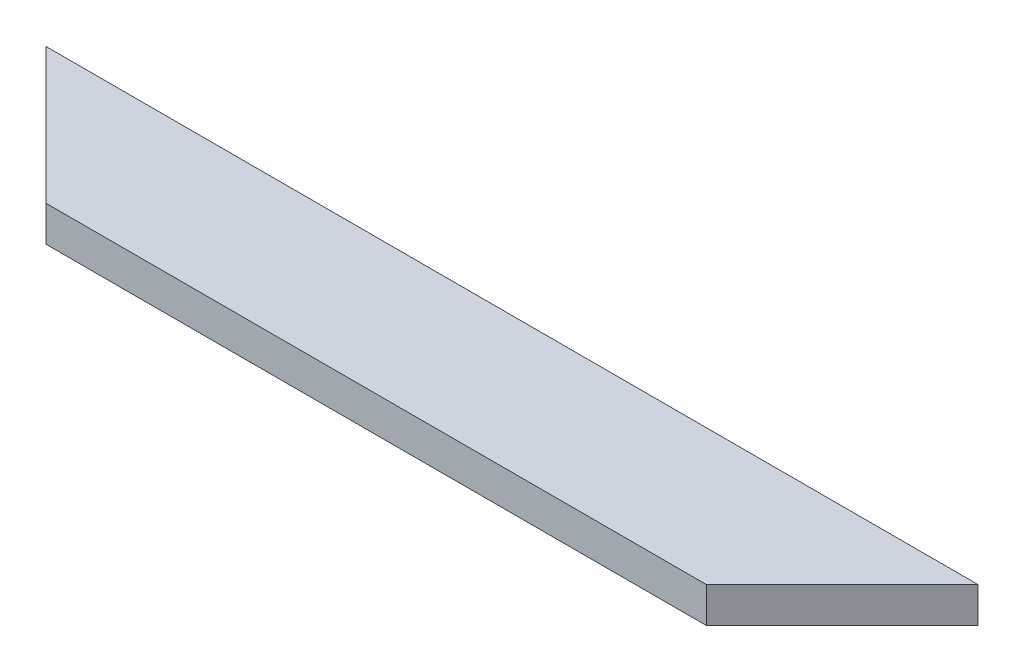
ISO-10303-21;
HEADER;
FILE_DESCRIPTION(('STEP AP214'),'2;1');
FILE_NAME('part.step','',(''),(''),'','','');
FILE_SCHEMA(('AUTOMOTIVE_DESIGN { 1 0 10303 214 1 1 1 1 }'));
ENDSEC;
DATA;
#1=APPLICATION_CONTEXT('core data for automotive mechanical design processes');
#2=APPLICATION_PROTOCOL_DEFINITION('international standard','automotive_design',2000,#1);
#3=PRODUCT_CONTEXT('',#1,'mechanical');
#4=PRODUCT('Part','Part','',(#3));
#5=PRODUCT_RELATED_PRODUCT_CATEGORY('part','',(#4));
#6=PRODUCT_DEFINITION_FORMATION('','',#4);
#7=PRODUCT_DEFINITION_CONTEXT('part definition',#1,'design');
#8=PRODUCT_DEFINITION('design','',#6,#7);
#9=PRODUCT_DEFINITION_SHAPE('','',#8);
#10=(LENGTH_UNIT() NAMED_UNIT(*) SI_UNIT(.MILLI.,.METRE.));
#11=(NAMED_UNIT(*) PLANE_ANGLE_UNIT() SI_UNIT($,.RADIAN.));
#12=(NAMED_UNIT(*) SI_UNIT($,.STERADIAN.) SOLID_ANGLE_UNIT());
#13=UNCERTAINTY_MEASURE_WITH_UNIT(LENGTH_MEASURE(1.E-05),#10,'distance_accuracy_value','');
#14=(GEOMETRIC_REPRESENTATION_CONTEXT(3) GLOBAL_UNCERTAINTY_ASSIGNED_CONTEXT((#13)) GLOBAL_UNIT_ASSIGNED_CONTEXT((#10,
#11,#12)) REPRESENTATION_CONTEXT('',''));
#15=CARTESIAN_POINT('',(0.,0.,0.));
#16=DIRECTION('',(0.,0.,1.));
#17=DIRECTION('',(1.,0.,0.));
#18=AXIS2_PLACEMENT_3D('',#15,#16,#17);
#19=CARTESIAN_POINT('',(0.,18.25625,0.));
#20=DIRECTION('',(0.,0.,1.));
#21=DIRECTION('',(1.,0.,0.));
#22=AXIS2_PLACEMENT_3D('',#19,#20,#21);
#23=PLANE('',#22);
#24=DIRECTION('',(-1.,0.,0.));
#25=VECTOR('',#24,1.);
#26=CARTESIAN_POINT('',(0.,0.,0.));
#27=LINE('',#26,#25);
#28=CARTESIAN_POINT('',(239.712500000001,0.,0.));
#29=VERTEX_POINT('',#28);
#30=CARTESIAN_POINT('',(-239.712500000001,0.,0.));
#31=VERTEX_POINT('',#30);
#32=EDGE_CURVE('E60',#29,#31,#27,.T.);
#33=ORIENTED_EDGE('',*,*,#32,.T.);
#34=DIRECTION('',(0.,-1.,0.));
#35=VECTOR('',#34,1.);
#36=CARTESIAN_POINT('',(-239.712500000001,18.25625,0.));
#37=LINE('',#36,#35);
#38=CARTESIAN_POINT('',(-239.712500000001,18.25625,0.));
#39=VERTEX_POINT('',#38);
#40=EDGE_CURVE('E11',#39,#31,#37,.T.);
#41=ORIENTED_EDGE('',*,*,#40,.F.);
#42=DIRECTION('',(-1.,0.,0.));
#43=VECTOR('',#42,1.);
#44=CARTESIAN_POINT('',(0.,18.25625,0.));
#45=LINE('',#44,#43);
#46=CARTESIAN_POINT('',(239.712500000001,18.25625,0.));
#47=VERTEX_POINT('',#46);
#48=EDGE_CURVE('E65',#47,#39,#45,.T.);
#49=ORIENTED_EDGE('',*,*,#48,.F.);
#50=DIRECTION('',(0.,-1.,0.));
#51=VECTOR('',#50,1.);
#52=CARTESIAN_POINT('',(239.712500000001,18.25625,0.));
#53=LINE('',#52,#51);
#54=EDGE_CURVE('E82',#47,#29,#53,.T.);
#55=ORIENTED_EDGE('',*,*,#54,.T.);
#56=EDGE_LOOP('',(#33,#41,#49,#55));
#57=FACE_BOUND('',#56,.T.);
#58=ADVANCED_FACE('F33',(#57),#23,.F.);
#59=CARTESIAN_POINT('',(-239.712500000001,18.25625,0.));
#60=DIRECTION('',(0.707106781186544,0.,-0.707106781186551));
#61=DIRECTION('',(-0.707106781186551,0.,-0.707106781186544));
#62=AXIS2_PLACEMENT_3D('',#59,#60,#61);
#63=PLANE('',#62);
#64=DIRECTION('',(0.707106781186551,0.,0.707106781186544));
#65=VECTOR('',#64,1.);
#66=CARTESIAN_POINT('',(-239.712500000001,0.,0.));
#67=LINE('',#66,#65);
#68=CARTESIAN_POINT('',(-169.8625,0.,69.85));
#69=VERTEX_POINT('',#68);
#70=EDGE_CURVE('E79',#31,#69,#67,.T.);
#71=ORIENTED_EDGE('',*,*,#70,.T.);
#72=DIRECTION('',(0.,-1.,0.));
#73=VECTOR('',#72,1.);
#74=CARTESIAN_POINT('',(-169.8625,18.25625,69.85));
#75=LINE('',#74,#73);
#76=CARTESIAN_POINT('',(-169.8625,18.25625,69.85));
#77=VERTEX_POINT('',#76);
#78=EDGE_CURVE('E41',#77,#69,#75,.T.);
#79=ORIENTED_EDGE('',*,*,#78,.F.);
#80=DIRECTION('',(0.707106781186551,0.,0.707106781186544));
#81=VECTOR('',#80,1.);
#82=CARTESIAN_POINT('',(-239.712500000001,18.25625,0.));
#83=LINE('',#82,#81);
#84=EDGE_CURVE('E49',#39,#77,#83,.T.);
#85=ORIENTED_EDGE('',*,*,#84,.F.);
#86=ORIENTED_EDGE('',*,*,#40,.T.);
#87=EDGE_LOOP('',(#71,#79,#85,#86));
#88=FACE_BOUND('',#87,.T.);
#89=ADVANCED_FACE('F106',(#88),#63,.F.);
#90=CARTESIAN_POINT('',(-169.8625,18.25625,69.85));
#91=DIRECTION('',(0.,0.,-1.));
#92=DIRECTION('',(-1.,0.,0.));
#93=AXIS2_PLACEMENT_3D('',#90,#91,#92);
#94=PLANE('',#93);
#95=DIRECTION('',(1.,0.,0.));
#96=VECTOR('',#95,1.);
#97=CARTESIAN_POINT('',(-169.8625,0.,69.85));
#98=LINE('',#97,#96);
#99=CARTESIAN_POINT('',(169.8625,0.,69.85));
#100=VERTEX_POINT('',#99);
#101=EDGE_CURVE('E96',#69,#100,#98,.T.);
#102=ORIENTED_EDGE('',*,*,#101,.T.);
#103=DIRECTION('',(0.,-1.,0.));
#104=VECTOR('',#103,1.);
#105=CARTESIAN_POINT('',(169.8625,18.25625,69.85));
#106=LINE('',#105,#104);
#107=CARTESIAN_POINT('',(169.8625,18.25625,69.85));
#108=VERTEX_POINT('',#107);
#109=EDGE_CURVE('E80',#108,#100,#106,.T.);
#110=ORIENTED_EDGE('',*,*,#109,.F.);
#111=DIRECTION('',(1.,0.,0.));
#112=VECTOR('',#111,1.);
#113=CARTESIAN_POINT('',(-169.8625,18.25625,69.85));
#114=LINE('',#113,#112);
#115=EDGE_CURVE('E98',#77,#108,#114,.T.);
#116=ORIENTED_EDGE('',*,*,#115,.F.);
#117=ORIENTED_EDGE('',*,*,#78,.T.);
#118=EDGE_LOOP('',(#102,#110,#116,#117));
#119=FACE_BOUND('',#118,.T.);
#120=ADVANCED_FACE('F104',(#119),#94,.F.);
#121=CARTESIAN_POINT('',(0.,18.25625,0.));
#122=DIRECTION('',(0.,1.,0.));
#123=DIRECTION('',(0.,0.,1.));
#124=AXIS2_PLACEMENT_3D('',#121,#122,#123);
#125=PLANE('',#124);
#126=ORIENTED_EDGE('',*,*,#115,.T.);
#127=DIRECTION('',(-0.707106781186551,0.,0.707106781186544));
#128=VECTOR('',#127,1.);
#129=CARTESIAN_POINT('',(239.712500000001,18.25625,0.));
#130=LINE('',#129,#128);
#131=EDGE_CURVE('E86',#47,#108,#130,.T.);
#132=ORIENTED_EDGE('',*,*,#131,.F.);
#133=ORIENTED_EDGE('',*,*,#48,.T.);
#134=ORIENTED_EDGE('',*,*,#84,.T.);
#135=EDGE_LOOP('',(#126,#132,#133,#134));
#136=FACE_BOUND('',#135,.T.);
#137=ADVANCED_FACE('F112',(#136),#125,.T.);
#138=CARTESIAN_POINT('',(0.,0.,0.));
#139=DIRECTION('',(0.,1.,0.));
#140=DIRECTION('',(0.,0.,1.));
#141=AXIS2_PLACEMENT_3D('',#138,#139,#140);
#142=PLANE('',#141);
#143=ORIENTED_EDGE('',*,*,#32,.F.);
#144=DIRECTION('',(-0.707106781186551,0.,0.707106781186544));
#145=VECTOR('',#144,1.);
#146=CARTESIAN_POINT('',(239.712500000001,0.,0.));
#147=LINE('',#146,#145);
#148=EDGE_CURVE('E78',#29,#100,#147,.T.);
#149=ORIENTED_EDGE('',*,*,#148,.T.);
#150=ORIENTED_EDGE('',*,*,#101,.F.);
#151=ORIENTED_EDGE('',*,*,#70,.F.);
#152=EDGE_LOOP('',(#143,#149,#150,#151));
#153=FACE_BOUND('',#152,.T.);
#154=ADVANCED_FACE('F75',(#153),#142,.F.);
#155=CARTESIAN_POINT('',(239.712500000001,18.25625,0.));
#156=DIRECTION('',(0.707106781186544,0.,0.707106781186551));
#157=DIRECTION('',(0.707106781186551,0.,-0.707106781186544));
#158=AXIS2_PLACEMENT_3D('',#155,#156,#157);
#159=PLANE('',#158);
#160=ORIENTED_EDGE('',*,*,#148,.F.);
#161=ORIENTED_EDGE('',*,*,#54,.F.);
#162=ORIENTED_EDGE('',*,*,#131,.T.);
#163=ORIENTED_EDGE('',*,*,#109,.T.);
#164=EDGE_LOOP('',(#160,#161,#162,#163));
#165=FACE_BOUND('',#164,.T.);
#166=ADVANCED_FACE('F89',(#165),#159,.T.);
#167=CLOSED_SHELL('',(#58,#89,#120,#137,#154,#166));
#168=MANIFOLD_SOLID_BREP('B2',#167);
#169=ADVANCED_BREP_SHAPE_REPRESENTATION('',(#18,#168),#14);
#170=SHAPE_DEFINITION_REPRESENTATION(#9,#169);
ENDSEC;
END-ISO-10303-21;
